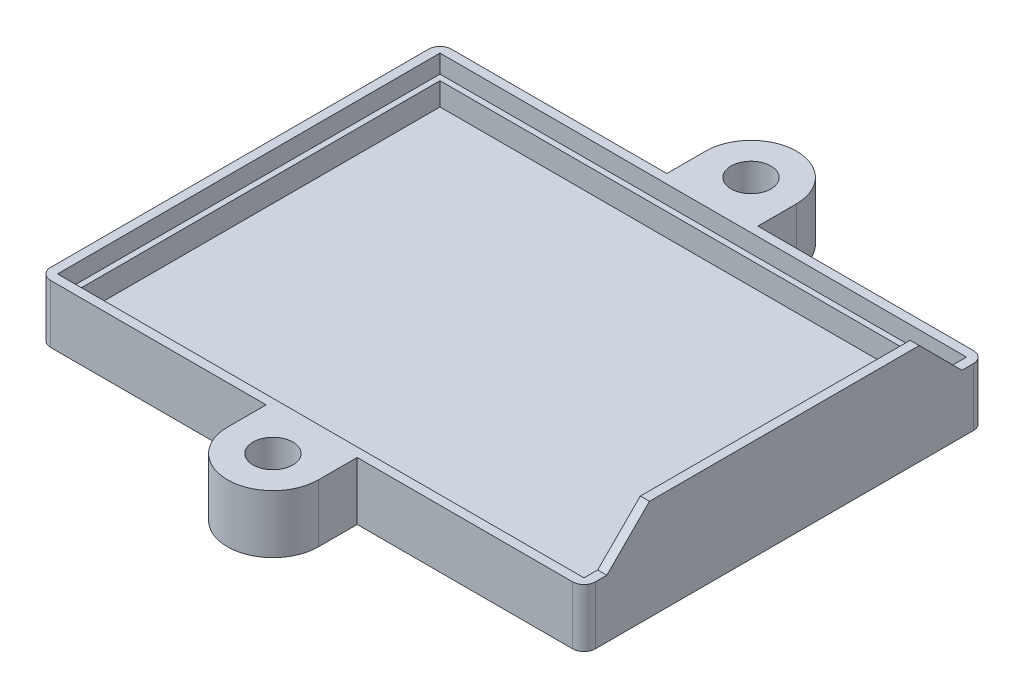
ISO-10303-21;
HEADER;
FILE_DESCRIPTION(('STEP AP214'),'2;1');
FILE_NAME('part.step','',(''),(''),'','','');
FILE_SCHEMA(('AUTOMOTIVE_DESIGN { 1 0 10303 214 1 1 1 1 }'));
ENDSEC;
DATA;
#1=APPLICATION_CONTEXT('core data for automotive mechanical design processes');
#2=APPLICATION_PROTOCOL_DEFINITION('international standard','automotive_design',2000,#1);
#3=PRODUCT_CONTEXT('',#1,'mechanical');
#4=PRODUCT('Part','Part','',(#3));
#5=PRODUCT_RELATED_PRODUCT_CATEGORY('part','',(#4));
#6=PRODUCT_DEFINITION_FORMATION('','',#4);
#7=PRODUCT_DEFINITION_CONTEXT('part definition',#1,'design');
#8=PRODUCT_DEFINITION('design','',#6,#7);
#9=PRODUCT_DEFINITION_SHAPE('','',#8);
#10=(LENGTH_UNIT() NAMED_UNIT(*) SI_UNIT(.MILLI.,.METRE.));
#11=(NAMED_UNIT(*) PLANE_ANGLE_UNIT() SI_UNIT($,.RADIAN.));
#12=(NAMED_UNIT(*) SI_UNIT($,.STERADIAN.) SOLID_ANGLE_UNIT());
#13=UNCERTAINTY_MEASURE_WITH_UNIT(LENGTH_MEASURE(1.E-05),#10,'distance_accuracy_value','');
#14=(GEOMETRIC_REPRESENTATION_CONTEXT(3) GLOBAL_UNCERTAINTY_ASSIGNED_CONTEXT((#13)) GLOBAL_UNIT_ASSIGNED_CONTEXT((#10,
#11,#12)) REPRESENTATION_CONTEXT('',''));
#15=CARTESIAN_POINT('',(0.,0.,0.));
#16=DIRECTION('',(0.,0.,1.));
#17=DIRECTION('',(1.,0.,0.));
#18=AXIS2_PLACEMENT_3D('',#15,#16,#17);
#19=CARTESIAN_POINT('',(23.925,5.1,-17.6));
#20=DIRECTION('',(0.,0.,1.));
#21=DIRECTION('',(1.,0.,0.));
#22=AXIS2_PLACEMENT_3D('',#19,#20,#21);
#23=PLANE('',#22);
#24=DIRECTION('',(0.,-1.,0.));
#25=VECTOR('',#24,1.);
#26=CARTESIAN_POINT('',(-4.,15.9977061806602,-17.6));
#27=LINE('',#26,#25);
#28=CARTESIAN_POINT('',(-4.,5.1,-17.6));
#29=VERTEX_POINT('',#28);
#30=CARTESIAN_POINT('',(-4.,0.,-17.6));
#31=VERTEX_POINT('',#30);
#32=EDGE_CURVE('E241',#29,#31,#27,.T.);
#33=ORIENTED_EDGE('',*,*,#32,.T.);
#34=DIRECTION('',(-1.,0.,0.));
#35=VECTOR('',#34,1.);
#36=CARTESIAN_POINT('',(23.925,0.,-17.6));
#37=LINE('',#36,#35);
#38=CARTESIAN_POINT('',(-22.925,0.,-17.6));
#39=VERTEX_POINT('',#38);
#40=EDGE_CURVE('E404',#31,#39,#37,.T.);
#41=ORIENTED_EDGE('',*,*,#40,.T.);
#42=DIRECTION('',(0.,-1.,0.));
#43=VECTOR('',#42,1.);
#44=CARTESIAN_POINT('',(-22.925,5.1,-17.6));
#45=LINE('',#44,#43);
#46=CARTESIAN_POINT('',(-22.925,5.1,-17.6));
#47=VERTEX_POINT('',#46);
#48=EDGE_CURVE('E423',#39,#47,#45,.F.);
#49=ORIENTED_EDGE('',*,*,#48,.T.);
#50=DIRECTION('',(-1.,0.,0.));
#51=VECTOR('',#50,1.);
#52=CARTESIAN_POINT('',(23.925,5.1,-17.6));
#53=LINE('',#52,#51);
#54=EDGE_CURVE('E52',#29,#47,#53,.T.);
#55=ORIENTED_EDGE('',*,*,#54,.F.);
#56=EDGE_LOOP('',(#33,#41,#49,#55));
#57=FACE_BOUND('',#56,.T.);
#58=ADVANCED_FACE('F37',(#57),#23,.F.);
#59=CARTESIAN_POINT('',(23.925,5.1,17.6));
#60=DIRECTION('',(0.,0.,-1.));
#61=DIRECTION('',(-1.,0.,0.));
#62=AXIS2_PLACEMENT_3D('',#59,#60,#61);
#63=PLANE('',#62);
#64=DIRECTION('',(0.,-1.,0.));
#65=VECTOR('',#64,1.);
#66=CARTESIAN_POINT('',(4.,15.9977061806602,17.6));
#67=LINE('',#66,#65);
#68=CARTESIAN_POINT('',(4.,5.1,17.6));
#69=VERTEX_POINT('',#68);
#70=CARTESIAN_POINT('',(4.,0.,17.6));
#71=VERTEX_POINT('',#70);
#72=EDGE_CURVE('E279',#69,#71,#67,.T.);
#73=ORIENTED_EDGE('',*,*,#72,.T.);
#74=DIRECTION('',(1.,0.,0.));
#75=VECTOR('',#74,1.);
#76=CARTESIAN_POINT('',(23.925,0.,17.6));
#77=LINE('',#76,#75);
#78=CARTESIAN_POINT('',(22.925,0.,17.6));
#79=VERTEX_POINT('',#78);
#80=EDGE_CURVE('E398',#71,#79,#77,.T.);
#81=ORIENTED_EDGE('',*,*,#80,.T.);
#82=DIRECTION('',(0.,-1.,0.));
#83=VECTOR('',#82,1.);
#84=CARTESIAN_POINT('',(22.925,5.1,17.6));
#85=LINE('',#84,#83);
#86=CARTESIAN_POINT('',(22.925,5.1,17.6));
#87=VERTEX_POINT('',#86);
#88=EDGE_CURVE('E45',#79,#87,#85,.F.);
#89=ORIENTED_EDGE('',*,*,#88,.T.);
#90=DIRECTION('',(1.,0.,0.));
#91=VECTOR('',#90,1.);
#92=CARTESIAN_POINT('',(23.925,5.1,17.6));
#93=LINE('',#92,#91);
#94=EDGE_CURVE('E385',#69,#87,#93,.T.);
#95=ORIENTED_EDGE('',*,*,#94,.F.);
#96=EDGE_LOOP('',(#73,#81,#89,#95));
#97=FACE_BOUND('',#96,.T.);
#98=ADVANCED_FACE('F441',(#97),#63,.F.);
#99=CARTESIAN_POINT('',(-23.925,5.1,-17.6));
#100=DIRECTION('',(1.,0.,0.));
#101=DIRECTION('',(0.,0.,-1.));
#102=AXIS2_PLACEMENT_3D('',#99,#100,#101);
#103=PLANE('',#102);
#104=DIRECTION('',(0.,0.,1.));
#105=VECTOR('',#104,1.);
#106=CARTESIAN_POINT('',(-23.925,5.1,-17.6));
#107=LINE('',#106,#105);
#108=CARTESIAN_POINT('',(-23.925,5.1,-16.6));
#109=VERTEX_POINT('',#108);
#110=CARTESIAN_POINT('',(-23.925,5.1,16.6));
#111=VERTEX_POINT('',#110);
#112=EDGE_CURVE('E382',#109,#111,#107,.T.);
#113=ORIENTED_EDGE('',*,*,#112,.F.);
#114=DIRECTION('',(0.,-1.,0.));
#115=VECTOR('',#114,1.);
#116=CARTESIAN_POINT('',(-23.925,5.1,-16.6));
#117=LINE('',#116,#115);
#118=CARTESIAN_POINT('',(-23.925,0.,-16.6));
#119=VERTEX_POINT('',#118);
#120=EDGE_CURVE('E407',#109,#119,#117,.T.);
#121=ORIENTED_EDGE('',*,*,#120,.T.);
#122=DIRECTION('',(0.,0.,1.));
#123=VECTOR('',#122,1.);
#124=CARTESIAN_POINT('',(-23.925,0.,-17.6));
#125=LINE('',#124,#123);
#126=CARTESIAN_POINT('',(-23.925,0.,16.6));
#127=VERTEX_POINT('',#126);
#128=EDGE_CURVE('E374',#119,#127,#125,.T.);
#129=ORIENTED_EDGE('',*,*,#128,.T.);
#130=DIRECTION('',(0.,-1.,0.));
#131=VECTOR('',#130,1.);
#132=CARTESIAN_POINT('',(-23.925,5.1,16.6));
#133=LINE('',#132,#131);
#134=EDGE_CURVE('E395',#127,#111,#133,.F.);
#135=ORIENTED_EDGE('',*,*,#134,.T.);
#136=EDGE_LOOP('',(#113,#121,#129,#135));
#137=FACE_BOUND('',#136,.T.);
#138=ADVANCED_FACE('F495',(#137),#103,.F.);
#139=CARTESIAN_POINT('',(-22.925,0.,17.6));
#140=VERTEX_POINT('',#139);
#141=CARTESIAN_POINT('',(-4.,0.,17.6));
#142=VERTEX_POINT('',#141);
#143=EDGE_CURVE('E399',#140,#142,#77,.T.);
#144=ORIENTED_EDGE('',*,*,#143,.T.);
#145=DIRECTION('',(0.,-1.,0.));
#146=VECTOR('',#145,1.);
#147=CARTESIAN_POINT('',(-4.,15.9977061806602,17.6));
#148=LINE('',#147,#146);
#149=CARTESIAN_POINT('',(-4.,5.1,17.6));
#150=VERTEX_POINT('',#149);
#151=EDGE_CURVE('E263',#150,#142,#148,.T.);
#152=ORIENTED_EDGE('',*,*,#151,.F.);
#153=CARTESIAN_POINT('',(-22.925,5.1,17.6));
#154=VERTEX_POINT('',#153);
#155=EDGE_CURVE('E387',#154,#150,#93,.T.);
#156=ORIENTED_EDGE('',*,*,#155,.F.);
#157=DIRECTION('',(0.,-1.,0.));
#158=VECTOR('',#157,1.);
#159=CARTESIAN_POINT('',(-22.925,5.1,17.6));
#160=LINE('',#159,#158);
#161=EDGE_CURVE('E12',#154,#140,#160,.T.);
#162=ORIENTED_EDGE('',*,*,#161,.T.);
#163=EDGE_LOOP('',(#144,#152,#156,#162));
#164=FACE_BOUND('',#163,.T.);
#165=ADVANCED_FACE('F497',(#164),#63,.F.);
#166=CARTESIAN_POINT('',(23.925,5.1,-17.6));
#167=DIRECTION('',(-1.,0.,0.));
#168=DIRECTION('',(0.,0.,1.));
#169=AXIS2_PLACEMENT_3D('',#166,#167,#168);
#170=PLANE('',#169);
#171=DIRECTION('',(0.,0.,-1.));
#172=VECTOR('',#171,1.);
#173=CARTESIAN_POINT('',(23.925,0.,-17.6));
#174=LINE('',#173,#172);
#175=CARTESIAN_POINT('',(23.925,0.,16.6));
#176=VERTEX_POINT('',#175);
#177=CARTESIAN_POINT('',(23.925,0.,-16.6));
#178=VERTEX_POINT('',#177);
#179=EDGE_CURVE('E401',#176,#178,#174,.T.);
#180=ORIENTED_EDGE('',*,*,#179,.T.);
#181=DIRECTION('',(0.,-1.,0.));
#182=VECTOR('',#181,1.);
#183=CARTESIAN_POINT('',(23.925,5.1,-16.6));
#184=LINE('',#183,#182);
#185=CARTESIAN_POINT('',(23.925,5.1,-16.6));
#186=VERTEX_POINT('',#185);
#187=EDGE_CURVE('E436',#178,#186,#184,.F.);
#188=ORIENTED_EDGE('',*,*,#187,.T.);
#189=DIRECTION('',(0.,0.,-1.));
#190=VECTOR('',#189,1.);
#191=CARTESIAN_POINT('',(23.925,5.1,-17.6));
#192=LINE('',#191,#190);
#193=CARTESIAN_POINT('',(23.925,5.1,-15.6));
#194=VERTEX_POINT('',#193);
#195=EDGE_CURVE('E390',#194,#186,#192,.T.);
#196=ORIENTED_EDGE('',*,*,#195,.F.);
#197=DIRECTION('',(0.,0.707106781186549,0.707106781186547));
#198=VECTOR('',#197,1.);
#199=CARTESIAN_POINT('',(23.925,5.1,-15.6));
#200=LINE('',#199,#198);
#201=CARTESIAN_POINT('',(23.925,8.85,-11.85));
#202=VERTEX_POINT('',#201);
#203=EDGE_CURVE('E290',#194,#202,#200,.T.);
#204=ORIENTED_EDGE('',*,*,#203,.T.);
#205=DIRECTION('',(0.,0.,1.));
#206=VECTOR('',#205,1.);
#207=CARTESIAN_POINT('',(23.925,8.85,11.85));
#208=LINE('',#207,#206);
#209=CARTESIAN_POINT('',(23.925,8.85,11.85));
#210=VERTEX_POINT('',#209);
#211=EDGE_CURVE('E299',#202,#210,#208,.T.);
#212=ORIENTED_EDGE('',*,*,#211,.T.);
#213=DIRECTION('',(0.,-0.707106781186549,0.707106781186546));
#214=VECTOR('',#213,1.);
#215=CARTESIAN_POINT('',(23.925,5.1,15.6));
#216=LINE('',#215,#214);
#217=CARTESIAN_POINT('',(23.925,5.1,15.6));
#218=VERTEX_POINT('',#217);
#219=EDGE_CURVE('E302',#210,#218,#216,.T.);
#220=ORIENTED_EDGE('',*,*,#219,.T.);
#221=CARTESIAN_POINT('',(23.925,5.1,16.6));
#222=VERTEX_POINT('',#221);
#223=EDGE_CURVE('E391',#222,#218,#192,.T.);
#224=ORIENTED_EDGE('',*,*,#223,.F.);
#225=DIRECTION('',(0.,-1.,0.));
#226=VECTOR('',#225,1.);
#227=CARTESIAN_POINT('',(23.925,5.1,16.6));
#228=LINE('',#227,#226);
#229=EDGE_CURVE('E433',#222,#176,#228,.T.);
#230=ORIENTED_EDGE('',*,*,#229,.T.);
#231=EDGE_LOOP('',(#180,#188,#196,#204,#212,#220,#224,#230));
#232=FACE_BOUND('',#231,.T.);
#233=ADVANCED_FACE('F447',(#232),#170,.F.);
#234=CARTESIAN_POINT('',(22.925,0.,-17.6));
#235=VERTEX_POINT('',#234);
#236=CARTESIAN_POINT('',(4.,0.,-17.6));
#237=VERTEX_POINT('',#236);
#238=EDGE_CURVE('E386',#235,#237,#37,.T.);
#239=ORIENTED_EDGE('',*,*,#238,.T.);
#240=DIRECTION('',(0.,-1.,0.));
#241=VECTOR('',#240,1.);
#242=CARTESIAN_POINT('',(4.,15.9977061806602,-17.6));
#243=LINE('',#242,#241);
#244=CARTESIAN_POINT('',(4.,5.1,-17.6));
#245=VERTEX_POINT('',#244);
#246=EDGE_CURVE('E60',#245,#237,#243,.T.);
#247=ORIENTED_EDGE('',*,*,#246,.F.);
#248=CARTESIAN_POINT('',(22.925,5.1,-17.6));
#249=VERTEX_POINT('',#248);
#250=EDGE_CURVE('E393',#249,#245,#53,.T.);
#251=ORIENTED_EDGE('',*,*,#250,.F.);
#252=DIRECTION('',(0.,-1.,0.));
#253=VECTOR('',#252,1.);
#254=CARTESIAN_POINT('',(22.925,5.1,-17.6));
#255=LINE('',#254,#253);
#256=EDGE_CURVE('E420',#249,#235,#255,.T.);
#257=ORIENTED_EDGE('',*,*,#256,.T.);
#258=EDGE_LOOP('',(#239,#247,#251,#257));
#259=FACE_BOUND('',#258,.T.);
#260=ADVANCED_FACE('F490',(#259),#23,.F.);
#261=CARTESIAN_POINT('',(0.,5.1,0.));
#262=DIRECTION('',(0.,-1.,0.));
#263=DIRECTION('',(0.,0.,-1.));
#264=AXIS2_PLACEMENT_3D('',#261,#262,#263);
#265=PLANE('',#264);
#266=ORIENTED_EDGE('',*,*,#250,.T.);
#267=DIRECTION('',(0.,0.,-1.));
#268=VECTOR('',#267,1.);
#269=CARTESIAN_POINT('',(4.,5.1,0.));
#270=LINE('',#269,#268);
#271=CARTESIAN_POINT('',(4.,5.1,-21.));
#272=VERTEX_POINT('',#271);
#273=EDGE_CURVE('E230',#245,#272,#270,.T.);
#274=ORIENTED_EDGE('',*,*,#273,.T.);
#275=CARTESIAN_POINT('',(0.,5.1,-21.));
#276=DIRECTION('',(0.,-1.,0.));
#277=DIRECTION('',(0.,0.,-1.));
#278=AXIS2_PLACEMENT_3D('',#275,#276,#277);
#279=CIRCLE('',#278,4.);
#280=CARTESIAN_POINT('',(-4.,5.1,-21.));
#281=VERTEX_POINT('',#280);
#282=EDGE_CURVE('E223',#281,#272,#279,.T.);
#283=ORIENTED_EDGE('',*,*,#282,.F.);
#284=DIRECTION('',(0.,0.,-1.));
#285=VECTOR('',#284,1.);
#286=CARTESIAN_POINT('',(-4.,5.1,0.));
#287=LINE('',#286,#285);
#288=EDGE_CURVE('E227',#29,#281,#287,.T.);
#289=ORIENTED_EDGE('',*,*,#288,.F.);
#290=ORIENTED_EDGE('',*,*,#54,.T.);
#291=CARTESIAN_POINT('',(-22.925,5.1,-16.6));
#292=DIRECTION('',(0.,-1.,0.));
#293=DIRECTION('',(0.,0.,-1.));
#294=AXIS2_PLACEMENT_3D('',#291,#292,#293);
#295=CIRCLE('',#294,1.);
#296=EDGE_CURVE('E431',#47,#109,#295,.F.);
#297=ORIENTED_EDGE('',*,*,#296,.T.);
#298=ORIENTED_EDGE('',*,*,#112,.T.);
#299=CARTESIAN_POINT('',(-22.925,5.1,16.6));
#300=DIRECTION('',(0.,-1.,0.));
#301=DIRECTION('',(0.,0.,-1.));
#302=AXIS2_PLACEMENT_3D('',#299,#300,#301);
#303=CIRCLE('',#302,1.);
#304=EDGE_CURVE('E427',#111,#154,#303,.F.);
#305=ORIENTED_EDGE('',*,*,#304,.T.);
#306=ORIENTED_EDGE('',*,*,#155,.T.);
#307=DIRECTION('',(0.,0.,1.));
#308=VECTOR('',#307,1.);
#309=CARTESIAN_POINT('',(-4.,5.1,0.));
#310=LINE('',#309,#308);
#311=CARTESIAN_POINT('',(-4.,5.1,21.));
#312=VERTEX_POINT('',#311);
#313=EDGE_CURVE('E265',#150,#312,#310,.T.);
#314=ORIENTED_EDGE('',*,*,#313,.T.);
#315=CARTESIAN_POINT('',(0.,5.1,21.));
#316=DIRECTION('',(0.,-1.,0.));
#317=DIRECTION('',(0.,0.,-1.));
#318=AXIS2_PLACEMENT_3D('',#315,#316,#317);
#319=CIRCLE('',#318,4.);
#320=CARTESIAN_POINT('',(4.,5.1,21.));
#321=VERTEX_POINT('',#320);
#322=EDGE_CURVE('E262',#312,#321,#319,.F.);
#323=ORIENTED_EDGE('',*,*,#322,.T.);
#324=DIRECTION('',(0.,0.,1.));
#325=VECTOR('',#324,1.);
#326=CARTESIAN_POINT('',(4.,5.1,0.));
#327=LINE('',#326,#325);
#328=EDGE_CURVE('E259',#69,#321,#327,.T.);
#329=ORIENTED_EDGE('',*,*,#328,.F.);
#330=ORIENTED_EDGE('',*,*,#94,.T.);
#331=CARTESIAN_POINT('',(22.925,5.1,16.6));
#332=DIRECTION('',(0.,-1.,0.));
#333=DIRECTION('',(0.,0.,-1.));
#334=AXIS2_PLACEMENT_3D('',#331,#332,#333);
#335=CIRCLE('',#334,1.);
#336=EDGE_CURVE('E425',#87,#222,#335,.F.);
#337=ORIENTED_EDGE('',*,*,#336,.T.);
#338=ORIENTED_EDGE('',*,*,#223,.T.);
#339=DIRECTION('',(1.,0.,0.));
#340=VECTOR('',#339,1.);
#341=CARTESIAN_POINT('',(-8.29955250278036,5.1,15.6));
#342=LINE('',#341,#340);
#343=CARTESIAN_POINT('',(23.125,5.1,15.6));
#344=VERTEX_POINT('',#343);
#345=EDGE_CURVE('E294',#344,#218,#342,.T.);
#346=ORIENTED_EDGE('',*,*,#345,.F.);
#347=DIRECTION('',(0.,0.,-1.));
#348=VECTOR('',#347,1.);
#349=CARTESIAN_POINT('',(23.125,5.1,16.8));
#350=LINE('',#349,#348);
#351=CARTESIAN_POINT('',(23.125,5.1,16.8));
#352=VERTEX_POINT('',#351);
#353=EDGE_CURVE('E367',#352,#344,#350,.T.);
#354=ORIENTED_EDGE('',*,*,#353,.F.);
#355=DIRECTION('',(1.,0.,0.));
#356=VECTOR('',#355,1.);
#357=CARTESIAN_POINT('',(23.125,5.1,16.8));
#358=LINE('',#357,#356);
#359=CARTESIAN_POINT('',(-23.125,5.1,16.8));
#360=VERTEX_POINT('',#359);
#361=EDGE_CURVE('E363',#360,#352,#358,.T.);
#362=ORIENTED_EDGE('',*,*,#361,.F.);
#363=DIRECTION('',(0.,0.,1.));
#364=VECTOR('',#363,1.);
#365=CARTESIAN_POINT('',(-23.125,5.1,16.8));
#366=LINE('',#365,#364);
#367=CARTESIAN_POINT('',(-23.125,5.1,-16.8));
#368=VERTEX_POINT('',#367);
#369=EDGE_CURVE('E347',#368,#360,#366,.T.);
#370=ORIENTED_EDGE('',*,*,#369,.F.);
#371=DIRECTION('',(-1.,0.,0.));
#372=VECTOR('',#371,1.);
#373=CARTESIAN_POINT('',(23.125,5.1,-16.8));
#374=LINE('',#373,#372);
#375=CARTESIAN_POINT('',(23.125,5.1,-16.8));
#376=VERTEX_POINT('',#375);
#377=EDGE_CURVE('E352',#376,#368,#374,.T.);
#378=ORIENTED_EDGE('',*,*,#377,.F.);
#379=CARTESIAN_POINT('',(23.125,5.1,-15.6));
#380=VERTEX_POINT('',#379);
#381=EDGE_CURVE('E366',#380,#376,#350,.T.);
#382=ORIENTED_EDGE('',*,*,#381,.F.);
#383=DIRECTION('',(1.,0.,0.));
#384=VECTOR('',#383,1.);
#385=CARTESIAN_POINT('',(-8.29955250278036,5.1,-15.6));
#386=LINE('',#385,#384);
#387=EDGE_CURVE('E305',#380,#194,#386,.T.);
#388=ORIENTED_EDGE('',*,*,#387,.T.);
#389=ORIENTED_EDGE('',*,*,#195,.T.);
#390=CARTESIAN_POINT('',(22.925,5.1,-16.6));
#391=DIRECTION('',(0.,-1.,0.));
#392=DIRECTION('',(0.,0.,-1.));
#393=AXIS2_PLACEMENT_3D('',#390,#391,#392);
#394=CIRCLE('',#393,1.);
#395=EDGE_CURVE('E429',#186,#249,#394,.F.);
#396=ORIENTED_EDGE('',*,*,#395,.T.);
#397=EDGE_LOOP('',(#266,#274,#283,#289,#290,#297,#298,#305,#306,#314,#323,#329,#330,#337,#338,
#346,#354,#362,#370,#378,#382,#388,#389,#396));
#398=FACE_BOUND('',#397,.T.);
#399=CARTESIAN_POINT('',(0.,5.1,21.));
#400=DIRECTION('',(0.,-1.,0.));
#401=DIRECTION('',(0.,0.,-1.));
#402=AXIS2_PLACEMENT_3D('',#399,#400,#401);
#403=CIRCLE('',#402,1.75);
#404=CARTESIAN_POINT('',(0.,5.1,19.25));
#405=VERTEX_POINT('',#404);
#406=EDGE_CURVE('E267',#405,#405,#403,.F.);
#407=ORIENTED_EDGE('',*,*,#406,.F.);
#408=EDGE_LOOP('',(#407));
#409=FACE_BOUND('',#408,.T.);
#410=CARTESIAN_POINT('',(0.,5.1,-21.));
#411=DIRECTION('',(0.,-1.,0.));
#412=DIRECTION('',(0.,0.,-1.));
#413=AXIS2_PLACEMENT_3D('',#410,#411,#412);
#414=CIRCLE('',#413,1.75);
#415=CARTESIAN_POINT('',(0.,5.1,-22.75));
#416=VERTEX_POINT('',#415);
#417=EDGE_CURVE('E254',#416,#416,#414,.T.);
#418=ORIENTED_EDGE('',*,*,#417,.T.);
#419=EDGE_LOOP('',(#418));
#420=FACE_BOUND('',#419,.T.);
#421=ADVANCED_FACE('F225',(#398,#409,#420),#265,.F.);
#422=CARTESIAN_POINT('',(0.,0.,0.));
#423=DIRECTION('',(0.,-1.,0.));
#424=DIRECTION('',(0.,0.,-1.));
#425=AXIS2_PLACEMENT_3D('',#422,#423,#424);
#426=PLANE('',#425);
#427=ORIENTED_EDGE('',*,*,#128,.F.);
#428=CARTESIAN_POINT('',(-22.925,0.,-16.6));
#429=DIRECTION('',(0.,-1.,0.));
#430=DIRECTION('',(0.,0.,-1.));
#431=AXIS2_PLACEMENT_3D('',#428,#429,#430);
#432=CIRCLE('',#431,1.);
#433=EDGE_CURVE('E417',#119,#39,#432,.T.);
#434=ORIENTED_EDGE('',*,*,#433,.T.);
#435=ORIENTED_EDGE('',*,*,#40,.F.);
#436=DIRECTION('',(0.,0.,1.));
#437=VECTOR('',#436,1.);
#438=CARTESIAN_POINT('',(-4.,0.,0.));
#439=LINE('',#438,#437);
#440=CARTESIAN_POINT('',(-4.,0.,-21.));
#441=VERTEX_POINT('',#440);
#442=EDGE_CURVE('E247',#441,#31,#439,.T.);
#443=ORIENTED_EDGE('',*,*,#442,.F.);
#444=CARTESIAN_POINT('',(0.,0.,-21.));
#445=DIRECTION('',(0.,-1.,0.));
#446=DIRECTION('',(0.,0.,-1.));
#447=AXIS2_PLACEMENT_3D('',#444,#445,#446);
#448=CIRCLE('',#447,4.);
#449=CARTESIAN_POINT('',(4.,0.,-21.));
#450=VERTEX_POINT('',#449);
#451=EDGE_CURVE('E245',#450,#441,#448,.F.);
#452=ORIENTED_EDGE('',*,*,#451,.F.);
#453=DIRECTION('',(0.,0.,1.));
#454=VECTOR('',#453,1.);
#455=CARTESIAN_POINT('',(4.,0.,0.));
#456=LINE('',#455,#454);
#457=EDGE_CURVE('E516',#450,#237,#456,.T.);
#458=ORIENTED_EDGE('',*,*,#457,.T.);
#459=ORIENTED_EDGE('',*,*,#238,.F.);
#460=CARTESIAN_POINT('',(22.925,0.,-16.6));
#461=DIRECTION('',(0.,-1.,0.));
#462=DIRECTION('',(0.,0.,-1.));
#463=AXIS2_PLACEMENT_3D('',#460,#461,#462);
#464=CIRCLE('',#463,1.);
#465=EDGE_CURVE('E415',#235,#178,#464,.T.);
#466=ORIENTED_EDGE('',*,*,#465,.T.);
#467=ORIENTED_EDGE('',*,*,#179,.F.);
#468=CARTESIAN_POINT('',(22.925,0.,16.6));
#469=DIRECTION('',(0.,-1.,0.));
#470=DIRECTION('',(0.,0.,-1.));
#471=AXIS2_PLACEMENT_3D('',#468,#469,#470);
#472=CIRCLE('',#471,1.);
#473=EDGE_CURVE('E410',#176,#79,#472,.T.);
#474=ORIENTED_EDGE('',*,*,#473,.T.);
#475=ORIENTED_EDGE('',*,*,#80,.F.);
#476=DIRECTION('',(0.,0.,-1.));
#477=VECTOR('',#476,1.);
#478=CARTESIAN_POINT('',(4.,0.,0.));
#479=LINE('',#478,#477);
#480=CARTESIAN_POINT('',(4.,0.,21.));
#481=VERTEX_POINT('',#480);
#482=EDGE_CURVE('E253',#481,#71,#479,.T.);
#483=ORIENTED_EDGE('',*,*,#482,.F.);
#484=CARTESIAN_POINT('',(0.,0.,21.));
#485=DIRECTION('',(0.,-1.,0.));
#486=DIRECTION('',(0.,0.,-1.));
#487=AXIS2_PLACEMENT_3D('',#484,#485,#486);
#488=CIRCLE('',#487,4.);
#489=CARTESIAN_POINT('',(-4.,0.,21.));
#490=VERTEX_POINT('',#489);
#491=EDGE_CURVE('E270',#481,#490,#488,.T.);
#492=ORIENTED_EDGE('',*,*,#491,.T.);
#493=DIRECTION('',(0.,0.,-1.));
#494=VECTOR('',#493,1.);
#495=CARTESIAN_POINT('',(-4.,0.,0.));
#496=LINE('',#495,#494);
#497=EDGE_CURVE('E273',#490,#142,#496,.T.);
#498=ORIENTED_EDGE('',*,*,#497,.T.);
#499=ORIENTED_EDGE('',*,*,#143,.F.);
#500=CARTESIAN_POINT('',(-22.925,0.,16.6));
#501=DIRECTION('',(0.,-1.,0.));
#502=DIRECTION('',(0.,0.,-1.));
#503=AXIS2_PLACEMENT_3D('',#500,#501,#502);
#504=CIRCLE('',#503,1.);
#505=EDGE_CURVE('E413',#140,#127,#504,.T.);
#506=ORIENTED_EDGE('',*,*,#505,.T.);
#507=EDGE_LOOP('',(#427,#434,#435,#443,#452,#458,#459,#466,#467,#474,#475,#483,#492,#498,#499,#506));
#508=FACE_BOUND('',#507,.T.);
#509=CARTESIAN_POINT('',(0.,0.,21.));
#510=DIRECTION('',(0.,-1.,0.));
#511=DIRECTION('',(0.,0.,-1.));
#512=AXIS2_PLACEMENT_3D('',#509,#510,#511);
#513=CIRCLE('',#512,1.75);
#514=CARTESIAN_POINT('',(0.,0.,19.25));
#515=VERTEX_POINT('',#514);
#516=EDGE_CURVE('E276',#515,#515,#513,.T.);
#517=ORIENTED_EDGE('',*,*,#516,.F.);
#518=EDGE_LOOP('',(#517));
#519=FACE_BOUND('',#518,.T.);
#520=CARTESIAN_POINT('',(0.,0.,-21.));
#521=DIRECTION('',(0.,-1.,0.));
#522=DIRECTION('',(0.,0.,-1.));
#523=AXIS2_PLACEMENT_3D('',#520,#521,#522);
#524=CIRCLE('',#523,1.75);
#525=CARTESIAN_POINT('',(0.,0.,-22.75));
#526=VERTEX_POINT('',#525);
#527=EDGE_CURVE('E258',#526,#526,#524,.F.);
#528=ORIENTED_EDGE('',*,*,#527,.T.);
#529=EDGE_LOOP('',(#528));
#530=FACE_BOUND('',#529,.T.);
#531=ADVANCED_FACE('F506',(#508,#519,#530),#426,.T.);
#532=CARTESIAN_POINT('',(-23.125,3.5,16.8));
#533=DIRECTION('',(-1.,0.,0.));
#534=DIRECTION('',(0.,0.,1.));
#535=AXIS2_PLACEMENT_3D('',#532,#533,#534);
#536=PLANE('',#535);
#537=ORIENTED_EDGE('',*,*,#369,.T.);
#538=DIRECTION('',(0.,1.,0.));
#539=VECTOR('',#538,1.);
#540=CARTESIAN_POINT('',(-23.125,3.5,16.8));
#541=LINE('',#540,#539);
#542=CARTESIAN_POINT('',(-23.125,3.5,16.8));
#543=VERTEX_POINT('',#542);
#544=EDGE_CURVE('E361',#543,#360,#541,.T.);
#545=ORIENTED_EDGE('',*,*,#544,.F.);
#546=DIRECTION('',(0.,0.,1.));
#547=VECTOR('',#546,1.);
#548=CARTESIAN_POINT('',(-23.125,3.5,16.8));
#549=LINE('',#548,#547);
#550=CARTESIAN_POINT('',(-23.125,3.5,-16.8));
#551=VERTEX_POINT('',#550);
#552=EDGE_CURVE('E348',#551,#543,#549,.T.);
#553=ORIENTED_EDGE('',*,*,#552,.F.);
#554=DIRECTION('',(0.,1.,0.));
#555=VECTOR('',#554,1.);
#556=CARTESIAN_POINT('',(-23.125,3.5,-16.8));
#557=LINE('',#556,#555);
#558=EDGE_CURVE('E372',#551,#368,#557,.T.);
#559=ORIENTED_EDGE('',*,*,#558,.T.);
#560=EDGE_LOOP('',(#537,#545,#553,#559));
#561=FACE_BOUND('',#560,.T.);
#562=ADVANCED_FACE('F467',(#561),#536,.F.);
#563=CARTESIAN_POINT('',(23.125,3.5,-16.8));
#564=DIRECTION('',(0.,0.,-1.));
#565=DIRECTION('',(-1.,0.,0.));
#566=AXIS2_PLACEMENT_3D('',#563,#564,#565);
#567=PLANE('',#566);
#568=ORIENTED_EDGE('',*,*,#377,.T.);
#569=ORIENTED_EDGE('',*,*,#558,.F.);
#570=DIRECTION('',(-1.,0.,0.));
#571=VECTOR('',#570,1.);
#572=CARTESIAN_POINT('',(23.125,3.5,-16.8));
#573=LINE('',#572,#571);
#574=CARTESIAN_POINT('',(23.125,3.5,-16.8));
#575=VERTEX_POINT('',#574);
#576=EDGE_CURVE('E358',#575,#551,#573,.T.);
#577=ORIENTED_EDGE('',*,*,#576,.F.);
#578=DIRECTION('',(0.,1.,0.));
#579=VECTOR('',#578,1.);
#580=CARTESIAN_POINT('',(23.125,3.5,-16.8));
#581=LINE('',#580,#579);
#582=EDGE_CURVE('E375',#575,#376,#581,.T.);
#583=ORIENTED_EDGE('',*,*,#582,.T.);
#584=EDGE_LOOP('',(#568,#569,#577,#583));
#585=FACE_BOUND('',#584,.T.);
#586=ADVANCED_FACE('F471',(#585),#567,.F.);
#587=CARTESIAN_POINT('',(23.125,3.5,16.8));
#588=DIRECTION('',(1.,0.,0.));
#589=DIRECTION('',(0.,0.,-1.));
#590=AXIS2_PLACEMENT_3D('',#587,#588,#589);
#591=PLANE('',#590);
#592=ORIENTED_EDGE('',*,*,#353,.T.);
#593=DIRECTION('',(0.,0.707106781186549,-0.707106781186546));
#594=VECTOR('',#593,1.);
#595=CARTESIAN_POINT('',(23.125,5.1,15.6));
#596=LINE('',#595,#594);
#597=CARTESIAN_POINT('',(23.125,8.85,11.85));
#598=VERTEX_POINT('',#597);
#599=EDGE_CURVE('E293',#344,#598,#596,.T.);
#600=ORIENTED_EDGE('',*,*,#599,.T.);
#601=DIRECTION('',(0.,0.,-1.));
#602=VECTOR('',#601,1.);
#603=CARTESIAN_POINT('',(23.125,8.85,11.85));
#604=LINE('',#603,#602);
#605=CARTESIAN_POINT('',(23.125,8.85,-11.85));
#606=VERTEX_POINT('',#605);
#607=EDGE_CURVE('E291',#598,#606,#604,.T.);
#608=ORIENTED_EDGE('',*,*,#607,.T.);
#609=DIRECTION('',(0.,-0.707106781186549,-0.707106781186546));
#610=VECTOR('',#609,1.);
#611=CARTESIAN_POINT('',(23.125,5.1,-15.6));
#612=LINE('',#611,#610);
#613=EDGE_CURVE('E296',#606,#380,#612,.T.);
#614=ORIENTED_EDGE('',*,*,#613,.T.);
#615=ORIENTED_EDGE('',*,*,#381,.T.);
#616=ORIENTED_EDGE('',*,*,#582,.F.);
#617=DIRECTION('',(0.,0.,-1.));
#618=VECTOR('',#617,1.);
#619=CARTESIAN_POINT('',(23.125,3.5,16.8));
#620=LINE('',#619,#618);
#621=CARTESIAN_POINT('',(23.125,3.5,16.8));
#622=VERTEX_POINT('',#621);
#623=EDGE_CURVE('E355',#622,#575,#620,.T.);
#624=ORIENTED_EDGE('',*,*,#623,.F.);
#625=DIRECTION('',(0.,1.,0.));
#626=VECTOR('',#625,1.);
#627=CARTESIAN_POINT('',(23.125,3.5,16.8));
#628=LINE('',#627,#626);
#629=EDGE_CURVE('E378',#622,#352,#628,.T.);
#630=ORIENTED_EDGE('',*,*,#629,.T.);
#631=EDGE_LOOP('',(#592,#600,#608,#614,#615,#616,#624,#630));
#632=FACE_BOUND('',#631,.T.);
#633=ADVANCED_FACE('F458',(#632),#591,.F.);
#634=CARTESIAN_POINT('',(23.125,3.5,16.8));
#635=DIRECTION('',(0.,0.,1.));
#636=DIRECTION('',(1.,0.,0.));
#637=AXIS2_PLACEMENT_3D('',#634,#635,#636);
#638=PLANE('',#637);
#639=ORIENTED_EDGE('',*,*,#361,.T.);
#640=ORIENTED_EDGE('',*,*,#629,.F.);
#641=DIRECTION('',(1.,0.,0.));
#642=VECTOR('',#641,1.);
#643=CARTESIAN_POINT('',(23.125,3.5,16.8));
#644=LINE('',#643,#642);
#645=EDGE_CURVE('E351',#543,#622,#644,.T.);
#646=ORIENTED_EDGE('',*,*,#645,.F.);
#647=ORIENTED_EDGE('',*,*,#544,.T.);
#648=EDGE_LOOP('',(#639,#640,#646,#647));
#649=FACE_BOUND('',#648,.T.);
#650=ADVANCED_FACE('F463',(#649),#638,.F.);
#651=CARTESIAN_POINT('',(0.,3.5,0.));
#652=DIRECTION('',(0.,1.,0.));
#653=DIRECTION('',(0.,0.,1.));
#654=AXIS2_PLACEMENT_3D('',#651,#652,#653);
#655=PLANE('',#654);
#656=DIRECTION('',(-1.,0.,0.));
#657=VECTOR('',#656,1.);
#658=CARTESIAN_POINT('',(22.625,3.5,-16.3));
#659=LINE('',#658,#657);
#660=CARTESIAN_POINT('',(22.625,3.5,-16.3));
#661=VERTEX_POINT('',#660);
#662=CARTESIAN_POINT('',(-22.625,3.5,-16.3));
#663=VERTEX_POINT('',#662);
#664=EDGE_CURVE('E315',#661,#663,#659,.T.);
#665=ORIENTED_EDGE('',*,*,#664,.F.);
#666=DIRECTION('',(0.,0.,-1.));
#667=VECTOR('',#666,1.);
#668=CARTESIAN_POINT('',(22.625,3.5,16.3));
#669=LINE('',#668,#667);
#670=CARTESIAN_POINT('',(22.625,3.5,16.3));
#671=VERTEX_POINT('',#670);
#672=EDGE_CURVE('E316',#671,#661,#669,.T.);
#673=ORIENTED_EDGE('',*,*,#672,.F.);
#674=DIRECTION('',(1.,0.,0.));
#675=VECTOR('',#674,1.);
#676=CARTESIAN_POINT('',(-22.625,3.5,16.3));
#677=LINE('',#676,#675);
#678=CARTESIAN_POINT('',(-22.625,3.5,16.3));
#679=VERTEX_POINT('',#678);
#680=EDGE_CURVE('E320',#679,#671,#677,.T.);
#681=ORIENTED_EDGE('',*,*,#680,.F.);
#682=DIRECTION('',(0.,0.,1.));
#683=VECTOR('',#682,1.);
#684=CARTESIAN_POINT('',(-22.625,3.5,-16.3));
#685=LINE('',#684,#683);
#686=EDGE_CURVE('E322',#663,#679,#685,.T.);
#687=ORIENTED_EDGE('',*,*,#686,.F.);
#688=EDGE_LOOP('',(#665,#673,#681,#687));
#689=FACE_BOUND('',#688,.T.);
#690=ORIENTED_EDGE('',*,*,#552,.T.);
#691=ORIENTED_EDGE('',*,*,#645,.T.);
#692=ORIENTED_EDGE('',*,*,#623,.T.);
#693=ORIENTED_EDGE('',*,*,#576,.T.);
#694=EDGE_LOOP('',(#690,#691,#692,#693));
#695=FACE_BOUND('',#694,.T.);
#696=ADVANCED_FACE('F473',(#689,#695),#655,.T.);
#697=CARTESIAN_POINT('',(0.,1.5,0.));
#698=DIRECTION('',(0.,-1.,0.));
#699=DIRECTION('',(0.,0.,-1.));
#700=AXIS2_PLACEMENT_3D('',#697,#698,#699);
#701=PLANE('',#700);
#702=DIRECTION('',(-1.,0.,0.));
#703=VECTOR('',#702,1.);
#704=CARTESIAN_POINT('',(22.625,1.5,-16.3));
#705=LINE('',#704,#703);
#706=CARTESIAN_POINT('',(22.625,1.5,-16.3));
#707=VERTEX_POINT('',#706);
#708=CARTESIAN_POINT('',(-22.625,1.5,-16.3));
#709=VERTEX_POINT('',#708);
#710=EDGE_CURVE('E330',#707,#709,#705,.T.);
#711=ORIENTED_EDGE('',*,*,#710,.T.);
#712=DIRECTION('',(0.,0.,1.));
#713=VECTOR('',#712,1.);
#714=CARTESIAN_POINT('',(-22.625,1.5,-16.3));
#715=LINE('',#714,#713);
#716=CARTESIAN_POINT('',(-22.625,1.49999999999999,16.3));
#717=VERTEX_POINT('',#716);
#718=EDGE_CURVE('E319',#709,#717,#715,.T.);
#719=ORIENTED_EDGE('',*,*,#718,.T.);
#720=DIRECTION('',(1.,0.,0.));
#721=VECTOR('',#720,1.);
#722=CARTESIAN_POINT('',(-22.625,1.5,16.3));
#723=LINE('',#722,#721);
#724=CARTESIAN_POINT('',(22.625,1.5,16.3));
#725=VERTEX_POINT('',#724);
#726=EDGE_CURVE('E339',#717,#725,#723,.T.);
#727=ORIENTED_EDGE('',*,*,#726,.T.);
#728=DIRECTION('',(0.,0.,-1.));
#729=VECTOR('',#728,1.);
#730=CARTESIAN_POINT('',(22.625,1.5,16.3));
#731=LINE('',#730,#729);
#732=EDGE_CURVE('E335',#725,#707,#731,.T.);
#733=ORIENTED_EDGE('',*,*,#732,.T.);
#734=EDGE_LOOP('',(#711,#719,#727,#733));
#735=FACE_BOUND('',#734,.T.);
#736=ADVANCED_FACE('F475',(#735),#701,.F.);
#737=CARTESIAN_POINT('',(-22.625,-55.7702653750186,-16.3));
#738=DIRECTION('',(-1.,0.,0.));
#739=DIRECTION('',(0.,0.,1.));
#740=AXIS2_PLACEMENT_3D('',#737,#738,#739);
#741=PLANE('',#740);
#742=DIRECTION('',(0.,1.,0.));
#743=VECTOR('',#742,1.);
#744=CARTESIAN_POINT('',(-22.625,-55.7702653750186,-16.3));
#745=LINE('',#744,#743);
#746=EDGE_CURVE('E333',#709,#663,#745,.T.);
#747=ORIENTED_EDGE('',*,*,#746,.T.);
#748=ORIENTED_EDGE('',*,*,#686,.T.);
#749=DIRECTION('',(0.,1.,0.));
#750=VECTOR('',#749,1.);
#751=CARTESIAN_POINT('',(-22.625,-55.7702653750186,16.3));
#752=LINE('',#751,#750);
#753=EDGE_CURVE('E329',#717,#679,#752,.T.);
#754=ORIENTED_EDGE('',*,*,#753,.F.);
#755=ORIENTED_EDGE('',*,*,#718,.F.);
#756=EDGE_LOOP('',(#747,#748,#754,#755));
#757=FACE_BOUND('',#756,.T.);
#758=ADVANCED_FACE('F482',(#757),#741,.F.);
#759=CARTESIAN_POINT('',(-22.625,-55.7702653750186,16.3));
#760=DIRECTION('',(0.,0.,1.));
#761=DIRECTION('',(1.,0.,0.));
#762=AXIS2_PLACEMENT_3D('',#759,#760,#761);
#763=PLANE('',#762);
#764=ORIENTED_EDGE('',*,*,#753,.T.);
#765=ORIENTED_EDGE('',*,*,#680,.T.);
#766=DIRECTION('',(0.,1.,0.));
#767=VECTOR('',#766,1.);
#768=CARTESIAN_POINT('',(22.625,-55.7702653750186,16.3));
#769=LINE('',#768,#767);
#770=EDGE_CURVE('E338',#725,#671,#769,.T.);
#771=ORIENTED_EDGE('',*,*,#770,.F.);
#772=ORIENTED_EDGE('',*,*,#726,.F.);
#773=EDGE_LOOP('',(#764,#765,#771,#772));
#774=FACE_BOUND('',#773,.T.);
#775=ADVANCED_FACE('F580',(#774),#763,.F.);
#776=CARTESIAN_POINT('',(22.625,-55.7702653750186,16.3));
#777=DIRECTION('',(1.,0.,0.));
#778=DIRECTION('',(0.,0.,-1.));
#779=AXIS2_PLACEMENT_3D('',#776,#777,#778);
#780=PLANE('',#779);
#781=ORIENTED_EDGE('',*,*,#770,.T.);
#782=ORIENTED_EDGE('',*,*,#672,.T.);
#783=DIRECTION('',(0.,1.,0.));
#784=VECTOR('',#783,1.);
#785=CARTESIAN_POINT('',(22.625,-55.7702653750186,-16.3));
#786=LINE('',#785,#784);
#787=EDGE_CURVE('E334',#707,#661,#786,.T.);
#788=ORIENTED_EDGE('',*,*,#787,.F.);
#789=ORIENTED_EDGE('',*,*,#732,.F.);
#790=EDGE_LOOP('',(#781,#782,#788,#789));
#791=FACE_BOUND('',#790,.T.);
#792=ADVANCED_FACE('F576',(#791),#780,.F.);
#793=CARTESIAN_POINT('',(22.625,-55.7702653750186,-16.3));
#794=DIRECTION('',(0.,0.,-1.));
#795=DIRECTION('',(-1.,0.,0.));
#796=AXIS2_PLACEMENT_3D('',#793,#794,#795);
#797=PLANE('',#796);
#798=ORIENTED_EDGE('',*,*,#787,.T.);
#799=ORIENTED_EDGE('',*,*,#664,.T.);
#800=ORIENTED_EDGE('',*,*,#746,.F.);
#801=ORIENTED_EDGE('',*,*,#710,.F.);
#802=EDGE_LOOP('',(#798,#799,#800,#801));
#803=FACE_BOUND('',#802,.T.);
#804=ADVANCED_FACE('F566',(#803),#797,.F.);
#805=CARTESIAN_POINT('',(-8.29955250278036,5.1,15.6));
#806=DIRECTION('',(0.,0.707106781186546,0.707106781186549));
#807=DIRECTION('',(0.,-0.707106781186549,0.707106781186546));
#808=AXIS2_PLACEMENT_3D('',#805,#806,#807);
#809=PLANE('',#808);
#810=ORIENTED_EDGE('',*,*,#599,.F.);
#811=ORIENTED_EDGE('',*,*,#345,.T.);
#812=ORIENTED_EDGE('',*,*,#219,.F.);
#813=DIRECTION('',(1.,0.,0.));
#814=VECTOR('',#813,1.);
#815=CARTESIAN_POINT('',(-8.29955250278036,8.85,11.85));
#816=LINE('',#815,#814);
#817=EDGE_CURVE('E308',#598,#210,#816,.T.);
#818=ORIENTED_EDGE('',*,*,#817,.F.);
#819=EDGE_LOOP('',(#810,#811,#812,#818));
#820=FACE_BOUND('',#819,.T.);
#821=ADVANCED_FACE('F454',(#820),#809,.T.);
#822=CARTESIAN_POINT('',(-8.29955250278036,8.85,11.85));
#823=DIRECTION('',(0.,1.,0.));
#824=DIRECTION('',(0.,0.,1.));
#825=AXIS2_PLACEMENT_3D('',#822,#823,#824);
#826=PLANE('',#825);
#827=ORIENTED_EDGE('',*,*,#607,.F.);
#828=ORIENTED_EDGE('',*,*,#817,.T.);
#829=ORIENTED_EDGE('',*,*,#211,.F.);
#830=DIRECTION('',(1.,0.,0.));
#831=VECTOR('',#830,1.);
#832=CARTESIAN_POINT('',(-8.29955250278036,8.85,-11.85));
#833=LINE('',#832,#831);
#834=EDGE_CURVE('E310',#606,#202,#833,.T.);
#835=ORIENTED_EDGE('',*,*,#834,.F.);
#836=EDGE_LOOP('',(#827,#828,#829,#835));
#837=FACE_BOUND('',#836,.T.);
#838=ADVANCED_FACE('F565',(#837),#826,.T.);
#839=CARTESIAN_POINT('',(-8.29955250278036,5.1,-15.6));
#840=DIRECTION('',(0.,0.707106781186546,-0.707106781186549));
#841=DIRECTION('',(0.,0.707106781186549,0.707106781186546));
#842=AXIS2_PLACEMENT_3D('',#839,#840,#841);
#843=PLANE('',#842);
#844=ORIENTED_EDGE('',*,*,#613,.F.);
#845=ORIENTED_EDGE('',*,*,#834,.T.);
#846=ORIENTED_EDGE('',*,*,#203,.F.);
#847=ORIENTED_EDGE('',*,*,#387,.F.);
#848=EDGE_LOOP('',(#844,#845,#846,#847));
#849=FACE_BOUND('',#848,.T.);
#850=ADVANCED_FACE('F569',(#849),#843,.T.);
#851=CARTESIAN_POINT('',(-22.925,5.1,-16.6));
#852=DIRECTION('',(0.,-1.,0.));
#853=DIRECTION('',(0.,0.,-1.));
#854=AXIS2_PLACEMENT_3D('',#851,#852,#853);
#855=CYLINDRICAL_SURFACE('',#854,1.);
#856=ORIENTED_EDGE('',*,*,#296,.F.);
#857=ORIENTED_EDGE('',*,*,#48,.F.);
#858=ORIENTED_EDGE('',*,*,#433,.F.);
#859=ORIENTED_EDGE('',*,*,#120,.F.);
#860=EDGE_LOOP('',(#856,#857,#858,#859));
#861=FACE_BOUND('',#860,.T.);
#862=ADVANCED_FACE('F528',(#861),#855,.T.);
#863=CARTESIAN_POINT('',(22.925,5.1,-16.6));
#864=DIRECTION('',(0.,-1.,0.));
#865=DIRECTION('',(0.,0.,-1.));
#866=AXIS2_PLACEMENT_3D('',#863,#864,#865);
#867=CYLINDRICAL_SURFACE('',#866,1.);
#868=ORIENTED_EDGE('',*,*,#395,.F.);
#869=ORIENTED_EDGE('',*,*,#187,.F.);
#870=ORIENTED_EDGE('',*,*,#465,.F.);
#871=ORIENTED_EDGE('',*,*,#256,.F.);
#872=EDGE_LOOP('',(#868,#869,#870,#871));
#873=FACE_BOUND('',#872,.T.);
#874=ADVANCED_FACE('F630',(#873),#867,.T.);
#875=CARTESIAN_POINT('',(-22.925,5.1,16.6));
#876=DIRECTION('',(0.,-1.,0.));
#877=DIRECTION('',(0.,0.,-1.));
#878=AXIS2_PLACEMENT_3D('',#875,#876,#877);
#879=CYLINDRICAL_SURFACE('',#878,1.);
#880=ORIENTED_EDGE('',*,*,#304,.F.);
#881=ORIENTED_EDGE('',*,*,#134,.F.);
#882=ORIENTED_EDGE('',*,*,#505,.F.);
#883=ORIENTED_EDGE('',*,*,#161,.F.);
#884=EDGE_LOOP('',(#880,#881,#882,#883));
#885=FACE_BOUND('',#884,.T.);
#886=ADVANCED_FACE('F534',(#885),#879,.T.);
#887=CARTESIAN_POINT('',(22.925,5.1,16.6));
#888=DIRECTION('',(0.,-1.,0.));
#889=DIRECTION('',(0.,0.,-1.));
#890=AXIS2_PLACEMENT_3D('',#887,#888,#889);
#891=CYLINDRICAL_SURFACE('',#890,1.);
#892=ORIENTED_EDGE('',*,*,#336,.F.);
#893=ORIENTED_EDGE('',*,*,#88,.F.);
#894=ORIENTED_EDGE('',*,*,#473,.F.);
#895=ORIENTED_EDGE('',*,*,#229,.F.);
#896=EDGE_LOOP('',(#892,#893,#894,#895));
#897=FACE_BOUND('',#896,.T.);
#898=ADVANCED_FACE('F39',(#897),#891,.T.);
#899=CARTESIAN_POINT('',(4.,15.9977061806602,0.));
#900=DIRECTION('',(-1.,0.,0.));
#901=DIRECTION('',(0.,0.,1.));
#902=AXIS2_PLACEMENT_3D('',#899,#900,#901);
#903=PLANE('',#902);
#904=ORIENTED_EDGE('',*,*,#72,.F.);
#905=ORIENTED_EDGE('',*,*,#328,.T.);
#906=DIRECTION('',(0.,-1.,0.));
#907=VECTOR('',#906,1.);
#908=CARTESIAN_POINT('',(4.,15.9977061806602,21.));
#909=LINE('',#908,#907);
#910=EDGE_CURVE('E284',#321,#481,#909,.T.);
#911=ORIENTED_EDGE('',*,*,#910,.T.);
#912=ORIENTED_EDGE('',*,*,#482,.T.);
#913=EDGE_LOOP('',(#904,#905,#911,#912));
#914=FACE_BOUND('',#913,.T.);
#915=ADVANCED_FACE('F552',(#914),#903,.F.);
#916=CARTESIAN_POINT('',(0.,15.9977061806602,21.));
#917=DIRECTION('',(0.,-1.,0.));
#918=DIRECTION('',(0.,0.,-1.));
#919=AXIS2_PLACEMENT_3D('',#916,#917,#918);
#920=CYLINDRICAL_SURFACE('',#919,4.);
#921=ORIENTED_EDGE('',*,*,#322,.F.);
#922=DIRECTION('',(0.,-1.,0.));
#923=VECTOR('',#922,1.);
#924=CARTESIAN_POINT('',(-4.,15.9977061806602,21.));
#925=LINE('',#924,#923);
#926=EDGE_CURVE('E282',#312,#490,#925,.T.);
#927=ORIENTED_EDGE('',*,*,#926,.T.);
#928=ORIENTED_EDGE('',*,*,#491,.F.);
#929=ORIENTED_EDGE('',*,*,#910,.F.);
#930=EDGE_LOOP('',(#921,#927,#928,#929));
#931=FACE_BOUND('',#930,.T.);
#932=ADVANCED_FACE('F549',(#931),#920,.T.);
#933=CARTESIAN_POINT('',(-4.,15.9977061806602,0.));
#934=DIRECTION('',(-1.,0.,0.));
#935=DIRECTION('',(0.,0.,1.));
#936=AXIS2_PLACEMENT_3D('',#933,#934,#935);
#937=PLANE('',#936);
#938=ORIENTED_EDGE('',*,*,#313,.F.);
#939=ORIENTED_EDGE('',*,*,#151,.T.);
#940=ORIENTED_EDGE('',*,*,#497,.F.);
#941=ORIENTED_EDGE('',*,*,#926,.F.);
#942=EDGE_LOOP('',(#938,#939,#940,#941));
#943=FACE_BOUND('',#942,.T.);
#944=ADVANCED_FACE('F542',(#943),#937,.T.);
#945=CARTESIAN_POINT('',(0.,15.9977061806602,21.));
#946=DIRECTION('',(0.,-1.,0.));
#947=DIRECTION('',(0.,0.,-1.));
#948=AXIS2_PLACEMENT_3D('',#945,#946,#947);
#949=CYLINDRICAL_SURFACE('',#948,1.75);
#950=ORIENTED_EDGE('',*,*,#406,.T.);
#951=EDGE_LOOP('',(#950));
#952=FACE_BOUND('',#951,.T.);
#953=ORIENTED_EDGE('',*,*,#516,.T.);
#954=EDGE_LOOP('',(#953));
#955=FACE_BOUND('',#954,.T.);
#956=ADVANCED_FACE('F685',(#952,#955),#949,.F.);
#957=CARTESIAN_POINT('',(-4.,15.9977061806602,0.));
#958=DIRECTION('',(1.,0.,0.));
#959=DIRECTION('',(0.,0.,-1.));
#960=AXIS2_PLACEMENT_3D('',#957,#958,#959);
#961=PLANE('',#960);
#962=ORIENTED_EDGE('',*,*,#32,.F.);
#963=ORIENTED_EDGE('',*,*,#288,.T.);
#964=DIRECTION('',(0.,-1.,0.));
#965=VECTOR('',#964,1.);
#966=CARTESIAN_POINT('',(-4.,15.9977061806602,-21.));
#967=LINE('',#966,#965);
#968=EDGE_CURVE('E239',#281,#441,#967,.T.);
#969=ORIENTED_EDGE('',*,*,#968,.T.);
#970=ORIENTED_EDGE('',*,*,#442,.T.);
#971=EDGE_LOOP('',(#962,#963,#969,#970));
#972=FACE_BOUND('',#971,.T.);
#973=ADVANCED_FACE('F237',(#972),#961,.F.);
#974=CARTESIAN_POINT('',(4.,15.9977061806602,0.));
#975=DIRECTION('',(1.,0.,0.));
#976=DIRECTION('',(0.,0.,-1.));
#977=AXIS2_PLACEMENT_3D('',#974,#975,#976);
#978=PLANE('',#977);
#979=ORIENTED_EDGE('',*,*,#273,.F.);
#980=ORIENTED_EDGE('',*,*,#246,.T.);
#981=ORIENTED_EDGE('',*,*,#457,.F.);
#982=DIRECTION('',(0.,-1.,0.));
#983=VECTOR('',#982,1.);
#984=CARTESIAN_POINT('',(4.,15.9977061806602,-21.));
#985=LINE('',#984,#983);
#986=EDGE_CURVE('E234',#272,#450,#985,.T.);
#987=ORIENTED_EDGE('',*,*,#986,.F.);
#988=EDGE_LOOP('',(#979,#980,#981,#987));
#989=FACE_BOUND('',#988,.T.);
#990=ADVANCED_FACE('F515',(#989),#978,.T.);
#991=CARTESIAN_POINT('',(0.,15.9977061806602,-21.));
#992=DIRECTION('',(0.,-1.,0.));
#993=DIRECTION('',(0.,0.,-1.));
#994=AXIS2_PLACEMENT_3D('',#991,#992,#993);
#995=CYLINDRICAL_SURFACE('',#994,4.);
#996=ORIENTED_EDGE('',*,*,#968,.F.);
#997=ORIENTED_EDGE('',*,*,#282,.T.);
#998=ORIENTED_EDGE('',*,*,#986,.T.);
#999=ORIENTED_EDGE('',*,*,#451,.T.);
#1000=EDGE_LOOP('',(#996,#997,#998,#999));
#1001=FACE_BOUND('',#1000,.T.);
#1002=ADVANCED_FACE('F243',(#1001),#995,.T.);
#1003=CARTESIAN_POINT('',(0.,15.9977061806602,-21.));
#1004=DIRECTION('',(0.,-1.,0.));
#1005=DIRECTION('',(0.,0.,-1.));
#1006=AXIS2_PLACEMENT_3D('',#1003,#1004,#1005);
#1007=CYLINDRICAL_SURFACE('',#1006,1.75);
#1008=ORIENTED_EDGE('',*,*,#417,.F.);
#1009=EDGE_LOOP('',(#1008));
#1010=FACE_BOUND('',#1009,.T.);
#1011=ORIENTED_EDGE('',*,*,#527,.F.);
#1012=EDGE_LOOP('',(#1011));
#1013=FACE_BOUND('',#1012,.T.);
#1014=ADVANCED_FACE('F718',(#1010,#1013),#1007,.F.);
#1015=CLOSED_SHELL('',(#58,#98,#138,#165,#233,#260,#421,#531,#562,#586,#633,#650,#696,#736,#758,
#775,#792,#804,#821,#838,#850,#862,#874,#886,#898,#915,#932,#944,#956,#973,#990,#1002,#1014));
#1016=MANIFOLD_SOLID_BREP('B2',#1015);
#1017=ADVANCED_BREP_SHAPE_REPRESENTATION('',(#18,#1016),#14);
#1018=SHAPE_DEFINITION_REPRESENTATION(#9,#1017);
ENDSEC;
END-ISO-10303-21;
